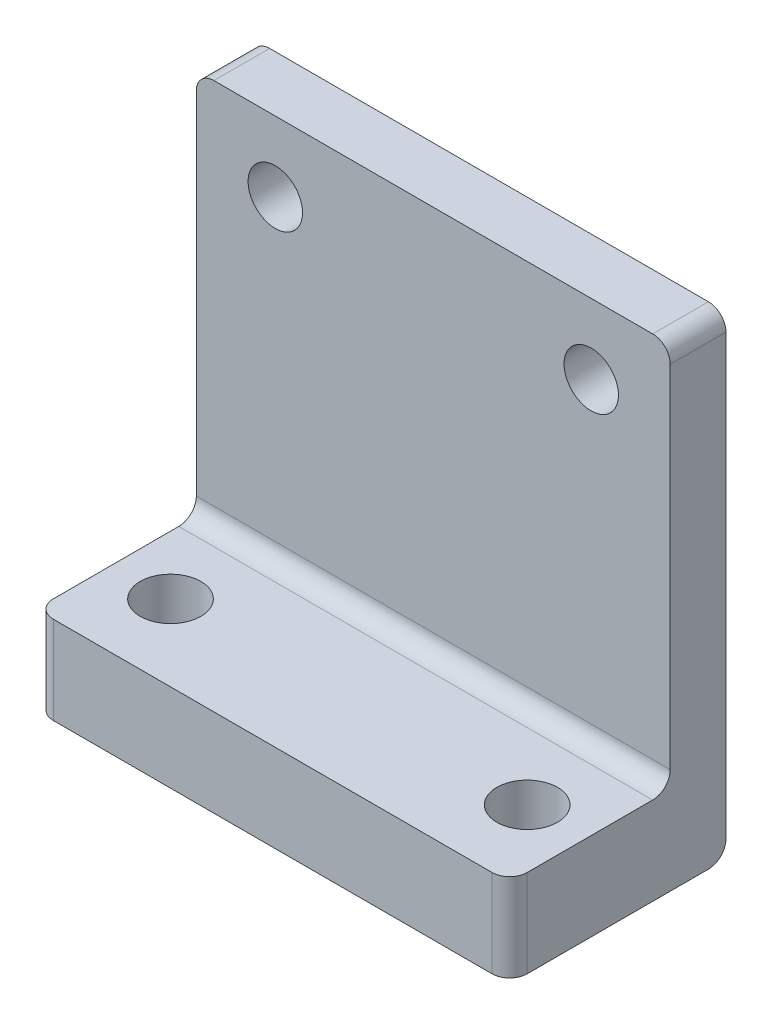
ISO-10303-21;
HEADER;
FILE_DESCRIPTION(('STEP AP214'),'2;1');
FILE_NAME('part.step','',(''),(''),'','','');
FILE_SCHEMA(('AUTOMOTIVE_DESIGN { 1 0 10303 214 1 1 1 1 }'));
ENDSEC;
DATA;
#1=APPLICATION_CONTEXT('core data for automotive mechanical design processes');
#2=APPLICATION_PROTOCOL_DEFINITION('international standard','automotive_design',2000,#1);
#3=PRODUCT_CONTEXT('',#1,'mechanical');
#4=PRODUCT('Part','Part','',(#3));
#5=PRODUCT_RELATED_PRODUCT_CATEGORY('part','',(#4));
#6=PRODUCT_DEFINITION_FORMATION('','',#4);
#7=PRODUCT_DEFINITION_CONTEXT('part definition',#1,'design');
#8=PRODUCT_DEFINITION('design','',#6,#7);
#9=PRODUCT_DEFINITION_SHAPE('','',#8);
#10=(LENGTH_UNIT() NAMED_UNIT(*) SI_UNIT(.MILLI.,.METRE.));
#11=(NAMED_UNIT(*) PLANE_ANGLE_UNIT() SI_UNIT($,.RADIAN.));
#12=(NAMED_UNIT(*) SI_UNIT($,.STERADIAN.) SOLID_ANGLE_UNIT());
#13=UNCERTAINTY_MEASURE_WITH_UNIT(LENGTH_MEASURE(1.E-05),#10,'distance_accuracy_value','');
#14=(GEOMETRIC_REPRESENTATION_CONTEXT(3) GLOBAL_UNCERTAINTY_ASSIGNED_CONTEXT((#13)) GLOBAL_UNIT_ASSIGNED_CONTEXT((#10,
#11,#12)) REPRESENTATION_CONTEXT('',''));
#15=CARTESIAN_POINT('',(0.,0.,0.));
#16=DIRECTION('',(0.,0.,1.));
#17=DIRECTION('',(1.,0.,0.));
#18=AXIS2_PLACEMENT_3D('',#15,#16,#17);
#19=CARTESIAN_POINT('',(0.,-20.,12.325));
#20=DIRECTION('',(0.,-1.,0.));
#21=DIRECTION('',(0.,0.,-1.));
#22=AXIS2_PLACEMENT_3D('',#19,#20,#21);
#23=PLANE('',#22);
#24=CARTESIAN_POINT('',(23.66,-20.,7.985));
#25=DIRECTION('',(0.,1.,0.));
#26=DIRECTION('',(0.,0.,1.));
#27=AXIS2_PLACEMENT_3D('',#24,#25,#26);
#28=CIRCLE('',#27,1.7272);
#29=CARTESIAN_POINT('',(23.66,-20.,9.71219999999999));
#30=VERTEX_POINT('',#29);
#31=EDGE_CURVE('E313',#30,#30,#28,.T.);
#32=ORIENTED_EDGE('',*,*,#31,.F.);
#33=EDGE_LOOP('',(#32));
#34=FACE_BOUND('',#33,.T.);
#35=DIRECTION('',(0.,0.,-1.));
#36=VECTOR('',#35,1.);
#37=CARTESIAN_POINT('',(27.,-20.,12.325));
#38=LINE('',#37,#36);
#39=CARTESIAN_POINT('',(27.,-20.,11.325));
#40=VERTEX_POINT('',#39);
#41=CARTESIAN_POINT('',(27.,-20.,4.175));
#42=VERTEX_POINT('',#41);
#43=EDGE_CURVE('E261',#40,#42,#38,.T.);
#44=ORIENTED_EDGE('',*,*,#43,.T.);
#45=DIRECTION('',(-1.,0.,0.));
#46=VECTOR('',#45,1.);
#47=CARTESIAN_POINT('',(0.,-20.,4.175));
#48=LINE('',#47,#46);
#49=CARTESIAN_POINT('',(0.,-20.,4.175));
#50=VERTEX_POINT('',#49);
#51=EDGE_CURVE('E216',#42,#50,#48,.T.);
#52=ORIENTED_EDGE('',*,*,#51,.T.);
#53=DIRECTION('',(0.,0.,-1.));
#54=VECTOR('',#53,1.);
#55=CARTESIAN_POINT('',(0.,-20.,12.325));
#56=LINE('',#55,#54);
#57=CARTESIAN_POINT('',(0.,-20.,11.325));
#58=VERTEX_POINT('',#57);
#59=EDGE_CURVE('E242',#58,#50,#56,.T.);
#60=ORIENTED_EDGE('',*,*,#59,.F.);
#61=CARTESIAN_POINT('',(1.,-20.,11.325));
#62=DIRECTION('',(0.,-1.,0.));
#63=DIRECTION('',(0.,0.,-1.));
#64=AXIS2_PLACEMENT_3D('',#61,#62,#63);
#65=CIRCLE('',#64,1.);
#66=CARTESIAN_POINT('',(1.,-20.,12.325));
#67=VERTEX_POINT('',#66);
#68=EDGE_CURVE('E213',#58,#67,#65,.F.);
#69=ORIENTED_EDGE('',*,*,#68,.T.);
#70=DIRECTION('',(-1.,0.,0.));
#71=VECTOR('',#70,1.);
#72=CARTESIAN_POINT('',(0.,-20.,12.325));
#73=LINE('',#72,#71);
#74=CARTESIAN_POINT('',(26.,-20.,12.325));
#75=VERTEX_POINT('',#74);
#76=EDGE_CURVE('E307',#75,#67,#73,.T.);
#77=ORIENTED_EDGE('',*,*,#76,.F.);
#78=CARTESIAN_POINT('',(26.,-20.,11.325));
#79=DIRECTION('',(0.,-1.,0.));
#80=DIRECTION('',(0.,0.,-1.));
#81=AXIS2_PLACEMENT_3D('',#78,#79,#80);
#82=CIRCLE('',#81,1.);
#83=EDGE_CURVE('E210',#75,#40,#82,.F.);
#84=ORIENTED_EDGE('',*,*,#83,.T.);
#85=EDGE_LOOP('',(#44,#52,#60,#69,#77,#84));
#86=FACE_BOUND('',#85,.T.);
#87=CARTESIAN_POINT('',(3.34,-20.,7.985));
#88=DIRECTION('',(0.,1.,0.));
#89=DIRECTION('',(0.,0.,1.));
#90=AXIS2_PLACEMENT_3D('',#87,#88,#89);
#91=CIRCLE('',#90,1.7272);
#92=CARTESIAN_POINT('',(3.34,-20.,9.7122));
#93=VERTEX_POINT('',#92);
#94=EDGE_CURVE('E323',#93,#93,#91,.T.);
#95=ORIENTED_EDGE('',*,*,#94,.F.);
#96=EDGE_LOOP('',(#95));
#97=FACE_BOUND('',#96,.T.);
#98=ADVANCED_FACE('F49',(#34,#86,#97),#23,.F.);
#99=CARTESIAN_POINT('',(27.,0.,3.175));
#100=DIRECTION('',(1.,0.,0.));
#101=DIRECTION('',(0.,1.,0.));
#102=AXIS2_PLACEMENT_3D('',#99,#100,#101);
#103=PLANE('',#102);
#104=DIRECTION('',(0.,-1.,0.));
#105=VECTOR('',#104,1.);
#106=CARTESIAN_POINT('',(27.,0.,0.));
#107=LINE('',#106,#105);
#108=CARTESIAN_POINT('',(27.,1.,0.));
#109=VERTEX_POINT('',#108);
#110=CARTESIAN_POINT('',(27.,-24.,0.));
#111=VERTEX_POINT('',#110);
#112=EDGE_CURVE('E163',#109,#111,#107,.T.);
#113=ORIENTED_EDGE('',*,*,#112,.F.);
#114=DIRECTION('',(0.,0.,-1.));
#115=VECTOR('',#114,1.);
#116=CARTESIAN_POINT('',(27.,1.,3.175));
#117=LINE('',#116,#115);
#118=CARTESIAN_POINT('',(27.,1.,3.175));
#119=VERTEX_POINT('',#118);
#120=EDGE_CURVE('E189',#109,#119,#117,.F.);
#121=ORIENTED_EDGE('',*,*,#120,.T.);
#122=DIRECTION('',(0.,-1.,0.));
#123=VECTOR('',#122,1.);
#124=CARTESIAN_POINT('',(27.,0.,3.175));
#125=LINE('',#124,#123);
#126=CARTESIAN_POINT('',(27.,-19.,3.175));
#127=VERTEX_POINT('',#126);
#128=EDGE_CURVE('E263',#119,#127,#125,.T.);
#129=ORIENTED_EDGE('',*,*,#128,.T.);
#130=CARTESIAN_POINT('',(27.,-19.,4.175));
#131=DIRECTION('',(1.,0.,0.));
#132=DIRECTION('',(0.,1.,0.));
#133=AXIS2_PLACEMENT_3D('',#130,#131,#132);
#134=CIRCLE('',#133,1.);
#135=EDGE_CURVE('E11',#127,#42,#134,.F.);
#136=ORIENTED_EDGE('',*,*,#135,.T.);
#137=ORIENTED_EDGE('',*,*,#43,.F.);
#138=DIRECTION('',(0.,1.,0.));
#139=VECTOR('',#138,1.);
#140=CARTESIAN_POINT('',(27.,0.,11.325));
#141=LINE('',#140,#139);
#142=CARTESIAN_POINT('',(27.,-25.,11.325));
#143=VERTEX_POINT('',#142);
#144=EDGE_CURVE('E186',#40,#143,#141,.F.);
#145=ORIENTED_EDGE('',*,*,#144,.T.);
#146=DIRECTION('',(0.,0.,-1.));
#147=VECTOR('',#146,1.);
#148=CARTESIAN_POINT('',(27.,-25.,3.175));
#149=LINE('',#148,#147);
#150=CARTESIAN_POINT('',(27.,-25.,1.));
#151=VERTEX_POINT('',#150);
#152=EDGE_CURVE('E175',#143,#151,#149,.T.);
#153=ORIENTED_EDGE('',*,*,#152,.T.);
#154=CARTESIAN_POINT('',(27.,-24.,1.));
#155=DIRECTION('',(1.,0.,0.));
#156=DIRECTION('',(0.,1.,0.));
#157=AXIS2_PLACEMENT_3D('',#154,#155,#156);
#158=CIRCLE('',#157,1.);
#159=EDGE_CURVE('E183',#151,#111,#158,.T.);
#160=ORIENTED_EDGE('',*,*,#159,.T.);
#161=EDGE_LOOP('',(#113,#121,#129,#136,#137,#145,#153,#160));
#162=FACE_BOUND('',#161,.T.);
#163=ADVANCED_FACE('F260',(#162),#103,.T.);
#164=CARTESIAN_POINT('',(0.,2.,3.175));
#165=DIRECTION('',(0.,1.,0.));
#166=DIRECTION('',(0.,0.,1.));
#167=AXIS2_PLACEMENT_3D('',#164,#165,#166);
#168=PLANE('',#167);
#169=DIRECTION('',(1.,0.,0.));
#170=VECTOR('',#169,1.);
#171=CARTESIAN_POINT('',(0.,2.,3.175));
#172=LINE('',#171,#170);
#173=CARTESIAN_POINT('',(1.,2.,3.175));
#174=VERTEX_POINT('',#173);
#175=CARTESIAN_POINT('',(26.,2.,3.175));
#176=VERTEX_POINT('',#175);
#177=EDGE_CURVE('E252',#174,#176,#172,.T.);
#178=ORIENTED_EDGE('',*,*,#177,.T.);
#179=DIRECTION('',(0.,0.,-1.));
#180=VECTOR('',#179,1.);
#181=CARTESIAN_POINT('',(26.,2.,3.175));
#182=LINE('',#181,#180);
#183=CARTESIAN_POINT('',(26.,2.,0.));
#184=VERTEX_POINT('',#183);
#185=EDGE_CURVE('E161',#176,#184,#182,.T.);
#186=ORIENTED_EDGE('',*,*,#185,.T.);
#187=DIRECTION('',(1.,0.,0.));
#188=VECTOR('',#187,1.);
#189=CARTESIAN_POINT('',(0.,2.,0.));
#190=LINE('',#189,#188);
#191=CARTESIAN_POINT('',(1.,2.,0.));
#192=VERTEX_POINT('',#191);
#193=EDGE_CURVE('E143',#192,#184,#190,.T.);
#194=ORIENTED_EDGE('',*,*,#193,.F.);
#195=DIRECTION('',(0.,0.,-1.));
#196=VECTOR('',#195,1.);
#197=CARTESIAN_POINT('',(1.,2.,3.175));
#198=LINE('',#197,#196);
#199=EDGE_CURVE('E158',#192,#174,#198,.F.);
#200=ORIENTED_EDGE('',*,*,#199,.T.);
#201=EDGE_LOOP('',(#178,#186,#194,#200));
#202=FACE_BOUND('',#201,.T.);
#203=ADVANCED_FACE('F157',(#202),#168,.T.);
#204=CARTESIAN_POINT('',(0.,0.,3.175));
#205=DIRECTION('',(1.,0.,0.));
#206=DIRECTION('',(0.,1.,0.));
#207=AXIS2_PLACEMENT_3D('',#204,#205,#206);
#208=PLANE('',#207);
#209=DIRECTION('',(0.,-1.,0.));
#210=VECTOR('',#209,1.);
#211=CARTESIAN_POINT('',(0.,0.,3.175));
#212=LINE('',#211,#210);
#213=CARTESIAN_POINT('',(0.,1.,3.175));
#214=VERTEX_POINT('',#213);
#215=CARTESIAN_POINT('',(0.,-19.,3.175));
#216=VERTEX_POINT('',#215);
#217=EDGE_CURVE('E240',#214,#216,#212,.T.);
#218=ORIENTED_EDGE('',*,*,#217,.F.);
#219=DIRECTION('',(0.,0.,-1.));
#220=VECTOR('',#219,1.);
#221=CARTESIAN_POINT('',(0.,1.,0.));
#222=LINE('',#221,#220);
#223=CARTESIAN_POINT('',(0.,1.,0.));
#224=VERTEX_POINT('',#223);
#225=EDGE_CURVE('E207',#214,#224,#222,.T.);
#226=ORIENTED_EDGE('',*,*,#225,.T.);
#227=DIRECTION('',(0.,-1.,0.));
#228=VECTOR('',#227,1.);
#229=CARTESIAN_POINT('',(0.,0.,0.));
#230=LINE('',#229,#228);
#231=CARTESIAN_POINT('',(0.,-24.,0.));
#232=VERTEX_POINT('',#231);
#233=EDGE_CURVE('E145',#224,#232,#230,.T.);
#234=ORIENTED_EDGE('',*,*,#233,.T.);
#235=CARTESIAN_POINT('',(0.,-24.,1.));
#236=DIRECTION('',(1.,0.,0.));
#237=DIRECTION('',(0.,1.,0.));
#238=AXIS2_PLACEMENT_3D('',#235,#236,#237);
#239=CIRCLE('',#238,1.);
#240=CARTESIAN_POINT('',(0.,-25.,1.));
#241=VERTEX_POINT('',#240);
#242=EDGE_CURVE('E200',#232,#241,#239,.F.);
#243=ORIENTED_EDGE('',*,*,#242,.T.);
#244=DIRECTION('',(0.,0.,-1.));
#245=VECTOR('',#244,1.);
#246=CARTESIAN_POINT('',(0.,-25.,3.175));
#247=LINE('',#246,#245);
#248=CARTESIAN_POINT('',(0.,-25.,11.325));
#249=VERTEX_POINT('',#248);
#250=EDGE_CURVE('E169',#249,#241,#247,.T.);
#251=ORIENTED_EDGE('',*,*,#250,.F.);
#252=DIRECTION('',(0.,1.,0.));
#253=VECTOR('',#252,1.);
#254=CARTESIAN_POINT('',(0.,-20.,11.325));
#255=LINE('',#254,#253);
#256=EDGE_CURVE('E203',#249,#58,#255,.T.);
#257=ORIENTED_EDGE('',*,*,#256,.T.);
#258=ORIENTED_EDGE('',*,*,#59,.T.);
#259=CARTESIAN_POINT('',(0.,-19.,4.175));
#260=DIRECTION('',(1.,0.,0.));
#261=DIRECTION('',(0.,1.,0.));
#262=AXIS2_PLACEMENT_3D('',#259,#260,#261);
#263=CIRCLE('',#262,1.);
#264=EDGE_CURVE('E58',#50,#216,#263,.T.);
#265=ORIENTED_EDGE('',*,*,#264,.T.);
#266=EDGE_LOOP('',(#218,#226,#234,#243,#251,#257,#258,#265));
#267=FACE_BOUND('',#266,.T.);
#268=ADVANCED_FACE('F239',(#267),#208,.F.);
#269=CARTESIAN_POINT('',(4.5,-2.,3.175));
#270=DIRECTION('',(0.,0.,-1.));
#271=DIRECTION('',(-1.,0.,0.));
#272=AXIS2_PLACEMENT_3D('',#269,#270,#271);
#273=CYLINDRICAL_SURFACE('',#272,1.55);
#274=CARTESIAN_POINT('',(4.5,-2.,3.175));
#275=DIRECTION('',(0.,0.,1.));
#276=DIRECTION('',(1.,0.,0.));
#277=AXIS2_PLACEMENT_3D('',#274,#275,#276);
#278=CIRCLE('',#277,1.55);
#279=CARTESIAN_POINT('',(6.05,-2.,3.175));
#280=VERTEX_POINT('',#279);
#281=EDGE_CURVE('E284',#280,#280,#278,.T.);
#282=ORIENTED_EDGE('',*,*,#281,.T.);
#283=EDGE_LOOP('',(#282));
#284=FACE_BOUND('',#283,.T.);
#285=CARTESIAN_POINT('',(4.5,-2.,0.));
#286=DIRECTION('',(0.,0.,1.));
#287=DIRECTION('',(1.,0.,0.));
#288=AXIS2_PLACEMENT_3D('',#285,#286,#287);
#289=CIRCLE('',#288,1.55);
#290=CARTESIAN_POINT('',(6.05,-2.,0.));
#291=VERTEX_POINT('',#290);
#292=EDGE_CURVE('E273',#291,#291,#289,.T.);
#293=ORIENTED_EDGE('',*,*,#292,.F.);
#294=EDGE_LOOP('',(#293));
#295=FACE_BOUND('',#294,.T.);
#296=ADVANCED_FACE('F351',(#284,#295),#273,.F.);
#297=CARTESIAN_POINT('',(22.5,-2.,3.175));
#298=DIRECTION('',(0.,0.,-1.));
#299=DIRECTION('',(-1.,0.,0.));
#300=AXIS2_PLACEMENT_3D('',#297,#298,#299);
#301=CYLINDRICAL_SURFACE('',#300,1.55);
#302=CARTESIAN_POINT('',(22.5,-2.,3.175));
#303=DIRECTION('',(0.,0.,1.));
#304=DIRECTION('',(1.,0.,0.));
#305=AXIS2_PLACEMENT_3D('',#302,#303,#304);
#306=CIRCLE('',#305,1.55);
#307=CARTESIAN_POINT('',(24.05,-2.,3.175));
#308=VERTEX_POINT('',#307);
#309=EDGE_CURVE('E280',#308,#308,#306,.T.);
#310=ORIENTED_EDGE('',*,*,#309,.T.);
#311=EDGE_LOOP('',(#310));
#312=FACE_BOUND('',#311,.T.);
#313=CARTESIAN_POINT('',(22.5,-2.,0.));
#314=DIRECTION('',(0.,0.,1.));
#315=DIRECTION('',(1.,0.,0.));
#316=AXIS2_PLACEMENT_3D('',#313,#314,#315);
#317=CIRCLE('',#316,1.55);
#318=CARTESIAN_POINT('',(24.05,-2.,0.));
#319=VERTEX_POINT('',#318);
#320=EDGE_CURVE('E268',#319,#319,#317,.T.);
#321=ORIENTED_EDGE('',*,*,#320,.F.);
#322=EDGE_LOOP('',(#321));
#323=FACE_BOUND('',#322,.T.);
#324=ADVANCED_FACE('F347',(#312,#323),#301,.F.);
#325=CARTESIAN_POINT('',(0.,-25.,3.175));
#326=DIRECTION('',(0.,1.,0.));
#327=DIRECTION('',(0.,0.,1.));
#328=AXIS2_PLACEMENT_3D('',#325,#326,#327);
#329=PLANE('',#328);
#330=CARTESIAN_POINT('',(3.34,-25.,7.985));
#331=DIRECTION('',(0.,1.,0.));
#332=DIRECTION('',(0.,0.,1.));
#333=AXIS2_PLACEMENT_3D('',#330,#331,#332);
#334=CIRCLE('',#333,1.7272);
#335=CARTESIAN_POINT('',(3.34,-25.,9.7122));
#336=VERTEX_POINT('',#335);
#337=EDGE_CURVE('E319',#336,#336,#334,.T.);
#338=ORIENTED_EDGE('',*,*,#337,.T.);
#339=EDGE_LOOP('',(#338));
#340=FACE_BOUND('',#339,.T.);
#341=CARTESIAN_POINT('',(23.66,-25.,7.985));
#342=DIRECTION('',(0.,1.,0.));
#343=DIRECTION('',(0.,0.,1.));
#344=AXIS2_PLACEMENT_3D('',#341,#342,#343);
#345=CIRCLE('',#344,1.7272);
#346=CARTESIAN_POINT('',(23.66,-25.,9.71219999999999));
#347=VERTEX_POINT('',#346);
#348=EDGE_CURVE('E309',#347,#347,#345,.T.);
#349=ORIENTED_EDGE('',*,*,#348,.T.);
#350=EDGE_LOOP('',(#349));
#351=FACE_BOUND('',#350,.T.);
#352=DIRECTION('',(-1.,0.,0.));
#353=VECTOR('',#352,1.);
#354=CARTESIAN_POINT('',(0.,-25.,12.325));
#355=LINE('',#354,#353);
#356=CARTESIAN_POINT('',(26.,-25.,12.325));
#357=VERTEX_POINT('',#356);
#358=CARTESIAN_POINT('',(1.,-25.,12.325));
#359=VERTEX_POINT('',#358);
#360=EDGE_CURVE('E275',#357,#359,#355,.T.);
#361=ORIENTED_EDGE('',*,*,#360,.T.);
#362=CARTESIAN_POINT('',(1.,-25.,11.325));
#363=DIRECTION('',(0.,1.,0.));
#364=DIRECTION('',(0.,0.,1.));
#365=AXIS2_PLACEMENT_3D('',#362,#363,#364);
#366=CIRCLE('',#365,1.);
#367=EDGE_CURVE('E232',#359,#249,#366,.F.);
#368=ORIENTED_EDGE('',*,*,#367,.T.);
#369=ORIENTED_EDGE('',*,*,#250,.T.);
#370=DIRECTION('',(1.,0.,0.));
#371=VECTOR('',#370,1.);
#372=CARTESIAN_POINT('',(0.,-25.,1.));
#373=LINE('',#372,#371);
#374=EDGE_CURVE('E226',#241,#151,#373,.T.);
#375=ORIENTED_EDGE('',*,*,#374,.T.);
#376=ORIENTED_EDGE('',*,*,#152,.F.);
#377=CARTESIAN_POINT('',(26.,-25.,11.325));
#378=DIRECTION('',(0.,1.,0.));
#379=DIRECTION('',(0.,0.,1.));
#380=AXIS2_PLACEMENT_3D('',#377,#378,#379);
#381=CIRCLE('',#380,1.);
#382=EDGE_CURVE('E72',#143,#357,#381,.F.);
#383=ORIENTED_EDGE('',*,*,#382,.T.);
#384=EDGE_LOOP('',(#361,#368,#369,#375,#376,#383));
#385=FACE_BOUND('',#384,.T.);
#386=ADVANCED_FACE('F301',(#340,#351,#385),#329,.F.);
#387=CARTESIAN_POINT('',(0.,0.,3.175));
#388=DIRECTION('',(0.,0.,1.));
#389=DIRECTION('',(1.,0.,0.));
#390=AXIS2_PLACEMENT_3D('',#387,#388,#389);
#391=PLANE('',#390);
#392=ORIENTED_EDGE('',*,*,#128,.F.);
#393=CARTESIAN_POINT('',(26.,1.,3.175));
#394=DIRECTION('',(0.,0.,1.));
#395=DIRECTION('',(1.,0.,0.));
#396=AXIS2_PLACEMENT_3D('',#393,#394,#395);
#397=CIRCLE('',#396,1.);
#398=EDGE_CURVE('E197',#119,#176,#397,.T.);
#399=ORIENTED_EDGE('',*,*,#398,.T.);
#400=ORIENTED_EDGE('',*,*,#177,.F.);
#401=CARTESIAN_POINT('',(1.,1.,3.175));
#402=DIRECTION('',(0.,0.,1.));
#403=DIRECTION('',(1.,0.,0.));
#404=AXIS2_PLACEMENT_3D('',#401,#402,#403);
#405=CIRCLE('',#404,1.);
#406=EDGE_CURVE('E167',#174,#214,#405,.T.);
#407=ORIENTED_EDGE('',*,*,#406,.T.);
#408=ORIENTED_EDGE('',*,*,#217,.T.);
#409=DIRECTION('',(-1.,0.,0.));
#410=VECTOR('',#409,1.);
#411=CARTESIAN_POINT('',(0.,-19.,3.175));
#412=LINE('',#411,#410);
#413=EDGE_CURVE('E192',#216,#127,#412,.F.);
#414=ORIENTED_EDGE('',*,*,#413,.T.);
#415=EDGE_LOOP('',(#392,#399,#400,#407,#408,#414));
#416=FACE_BOUND('',#415,.T.);
#417=ORIENTED_EDGE('',*,*,#309,.F.);
#418=EDGE_LOOP('',(#417));
#419=FACE_BOUND('',#418,.T.);
#420=ORIENTED_EDGE('',*,*,#281,.F.);
#421=EDGE_LOOP('',(#420));
#422=FACE_BOUND('',#421,.T.);
#423=ADVANCED_FACE('F248',(#416,#419,#422),#391,.T.);
#424=CARTESIAN_POINT('',(0.,0.,0.));
#425=DIRECTION('',(0.,0.,1.));
#426=DIRECTION('',(1.,0.,0.));
#427=AXIS2_PLACEMENT_3D('',#424,#425,#426);
#428=PLANE('',#427);
#429=ORIENTED_EDGE('',*,*,#320,.T.);
#430=EDGE_LOOP('',(#429));
#431=FACE_BOUND('',#430,.T.);
#432=ORIENTED_EDGE('',*,*,#292,.T.);
#433=EDGE_LOOP('',(#432));
#434=FACE_BOUND('',#433,.T.);
#435=ORIENTED_EDGE('',*,*,#193,.T.);
#436=CARTESIAN_POINT('',(26.,1.,0.));
#437=DIRECTION('',(0.,0.,1.));
#438=DIRECTION('',(1.,0.,0.));
#439=AXIS2_PLACEMENT_3D('',#436,#437,#438);
#440=CIRCLE('',#439,1.);
#441=EDGE_CURVE('E151',#184,#109,#440,.F.);
#442=ORIENTED_EDGE('',*,*,#441,.T.);
#443=ORIENTED_EDGE('',*,*,#112,.T.);
#444=DIRECTION('',(1.,0.,0.));
#445=VECTOR('',#444,1.);
#446=CARTESIAN_POINT('',(0.,-24.,0.));
#447=LINE('',#446,#445);
#448=EDGE_CURVE('E152',#111,#232,#447,.F.);
#449=ORIENTED_EDGE('',*,*,#448,.T.);
#450=ORIENTED_EDGE('',*,*,#233,.F.);
#451=CARTESIAN_POINT('',(1.,1.,0.));
#452=DIRECTION('',(0.,0.,1.));
#453=DIRECTION('',(1.,0.,0.));
#454=AXIS2_PLACEMENT_3D('',#451,#452,#453);
#455=CIRCLE('',#454,1.);
#456=EDGE_CURVE('E140',#224,#192,#455,.F.);
#457=ORIENTED_EDGE('',*,*,#456,.T.);
#458=EDGE_LOOP('',(#435,#442,#443,#449,#450,#457));
#459=FACE_BOUND('',#458,.T.);
#460=ADVANCED_FACE('F142',(#431,#434,#459),#428,.F.);
#461=CARTESIAN_POINT('',(0.,0.,12.325));
#462=DIRECTION('',(0.,0.,1.));
#463=DIRECTION('',(1.,0.,0.));
#464=AXIS2_PLACEMENT_3D('',#461,#462,#463);
#465=PLANE('',#464);
#466=ORIENTED_EDGE('',*,*,#76,.T.);
#467=DIRECTION('',(0.,1.,0.));
#468=VECTOR('',#467,1.);
#469=CARTESIAN_POINT('',(1.,-25.,12.325));
#470=LINE('',#469,#468);
#471=EDGE_CURVE('E65',#67,#359,#470,.F.);
#472=ORIENTED_EDGE('',*,*,#471,.T.);
#473=ORIENTED_EDGE('',*,*,#360,.F.);
#474=DIRECTION('',(0.,1.,0.));
#475=VECTOR('',#474,1.);
#476=CARTESIAN_POINT('',(26.,0.,12.325));
#477=LINE('',#476,#475);
#478=EDGE_CURVE('E220',#357,#75,#477,.T.);
#479=ORIENTED_EDGE('',*,*,#478,.T.);
#480=EDGE_LOOP('',(#466,#472,#473,#479));
#481=FACE_BOUND('',#480,.T.);
#482=ADVANCED_FACE('F306',(#481),#465,.T.);
#483=CARTESIAN_POINT('',(23.66,-20.,7.985));
#484=DIRECTION('',(0.,1.,0.));
#485=DIRECTION('',(0.,0.,1.));
#486=AXIS2_PLACEMENT_3D('',#483,#484,#485);
#487=CYLINDRICAL_SURFACE('',#486,1.7272);
#488=ORIENTED_EDGE('',*,*,#348,.F.);
#489=EDGE_LOOP('',(#488));
#490=FACE_BOUND('',#489,.T.);
#491=ORIENTED_EDGE('',*,*,#31,.T.);
#492=EDGE_LOOP('',(#491));
#493=FACE_BOUND('',#492,.T.);
#494=ADVANCED_FACE('F430',(#490,#493),#487,.F.);
#495=CARTESIAN_POINT('',(3.34,-20.,7.985));
#496=DIRECTION('',(0.,1.,0.));
#497=DIRECTION('',(0.,0.,1.));
#498=AXIS2_PLACEMENT_3D('',#495,#496,#497);
#499=CYLINDRICAL_SURFACE('',#498,1.7272);
#500=ORIENTED_EDGE('',*,*,#337,.F.);
#501=EDGE_LOOP('',(#500));
#502=FACE_BOUND('',#501,.T.);
#503=ORIENTED_EDGE('',*,*,#94,.T.);
#504=EDGE_LOOP('',(#503));
#505=FACE_BOUND('',#504,.T.);
#506=ADVANCED_FACE('F328',(#502,#505),#499,.F.);
#507=CARTESIAN_POINT('',(26.,1.,3.175));
#508=DIRECTION('',(0.,0.,-1.));
#509=DIRECTION('',(-1.,0.,0.));
#510=AXIS2_PLACEMENT_3D('',#507,#508,#509);
#511=CYLINDRICAL_SURFACE('',#510,1.);
#512=ORIENTED_EDGE('',*,*,#398,.F.);
#513=ORIENTED_EDGE('',*,*,#120,.F.);
#514=ORIENTED_EDGE('',*,*,#441,.F.);
#515=ORIENTED_EDGE('',*,*,#185,.F.);
#516=EDGE_LOOP('',(#512,#513,#514,#515));
#517=FACE_BOUND('',#516,.T.);
#518=ADVANCED_FACE('F360',(#517),#511,.T.);
#519=CARTESIAN_POINT('',(1.,1.,3.175));
#520=DIRECTION('',(0.,0.,1.));
#521=DIRECTION('',(1.,0.,0.));
#522=AXIS2_PLACEMENT_3D('',#519,#520,#521);
#523=CYLINDRICAL_SURFACE('',#522,1.);
#524=ORIENTED_EDGE('',*,*,#406,.F.);
#525=ORIENTED_EDGE('',*,*,#199,.F.);
#526=ORIENTED_EDGE('',*,*,#456,.F.);
#527=ORIENTED_EDGE('',*,*,#225,.F.);
#528=EDGE_LOOP('',(#524,#525,#526,#527));
#529=FACE_BOUND('',#528,.T.);
#530=ADVANCED_FACE('F166',(#529),#523,.T.);
#531=CARTESIAN_POINT('',(0.,-19.,4.175));
#532=DIRECTION('',(-1.,0.,0.));
#533=DIRECTION('',(0.,0.,1.));
#534=AXIS2_PLACEMENT_3D('',#531,#532,#533);
#535=CYLINDRICAL_SURFACE('',#534,1.);
#536=ORIENTED_EDGE('',*,*,#135,.F.);
#537=ORIENTED_EDGE('',*,*,#413,.F.);
#538=ORIENTED_EDGE('',*,*,#264,.F.);
#539=ORIENTED_EDGE('',*,*,#51,.F.);
#540=EDGE_LOOP('',(#536,#537,#538,#539));
#541=FACE_BOUND('',#540,.T.);
#542=ADVANCED_FACE('F255',(#541),#535,.F.);
#543=CARTESIAN_POINT('',(1.,0.,11.325));
#544=DIRECTION('',(0.,-1.,0.));
#545=DIRECTION('',(1.,0.,0.));
#546=AXIS2_PLACEMENT_3D('',#543,#544,#545);
#547=CYLINDRICAL_SURFACE('',#546,1.);
#548=ORIENTED_EDGE('',*,*,#367,.F.);
#549=ORIENTED_EDGE('',*,*,#471,.F.);
#550=ORIENTED_EDGE('',*,*,#68,.F.);
#551=ORIENTED_EDGE('',*,*,#256,.F.);
#552=EDGE_LOOP('',(#548,#549,#550,#551));
#553=FACE_BOUND('',#552,.T.);
#554=ADVANCED_FACE('F368',(#553),#547,.T.);
#555=CARTESIAN_POINT('',(26.,0.,11.325));
#556=DIRECTION('',(0.,1.,0.));
#557=DIRECTION('',(-1.,0.,0.));
#558=AXIS2_PLACEMENT_3D('',#555,#556,#557);
#559=CYLINDRICAL_SURFACE('',#558,1.);
#560=ORIENTED_EDGE('',*,*,#382,.F.);
#561=ORIENTED_EDGE('',*,*,#144,.F.);
#562=ORIENTED_EDGE('',*,*,#83,.F.);
#563=ORIENTED_EDGE('',*,*,#478,.F.);
#564=EDGE_LOOP('',(#560,#561,#562,#563));
#565=FACE_BOUND('',#564,.T.);
#566=ADVANCED_FACE('F305',(#565),#559,.T.);
#567=CARTESIAN_POINT('',(0.,-24.,1.));
#568=DIRECTION('',(1.,0.,0.));
#569=DIRECTION('',(0.,0.,-1.));
#570=AXIS2_PLACEMENT_3D('',#567,#568,#569);
#571=CYLINDRICAL_SURFACE('',#570,1.);
#572=ORIENTED_EDGE('',*,*,#242,.F.);
#573=ORIENTED_EDGE('',*,*,#448,.F.);
#574=ORIENTED_EDGE('',*,*,#159,.F.);
#575=ORIENTED_EDGE('',*,*,#374,.F.);
#576=EDGE_LOOP('',(#572,#573,#574,#575));
#577=FACE_BOUND('',#576,.T.);
#578=ADVANCED_FACE('F51',(#577),#571,.T.);
#579=CLOSED_SHELL('',(#98,#163,#203,#268,#296,#324,#386,#423,#460,#482,#494,#506,#518,#530,#542,
#554,#566,#578));
#580=MANIFOLD_SOLID_BREP('B2',#579);
#581=ADVANCED_BREP_SHAPE_REPRESENTATION('',(#18,#580),#14);
#582=SHAPE_DEFINITION_REPRESENTATION(#9,#581);
ENDSEC;
END-ISO-10303-21;
